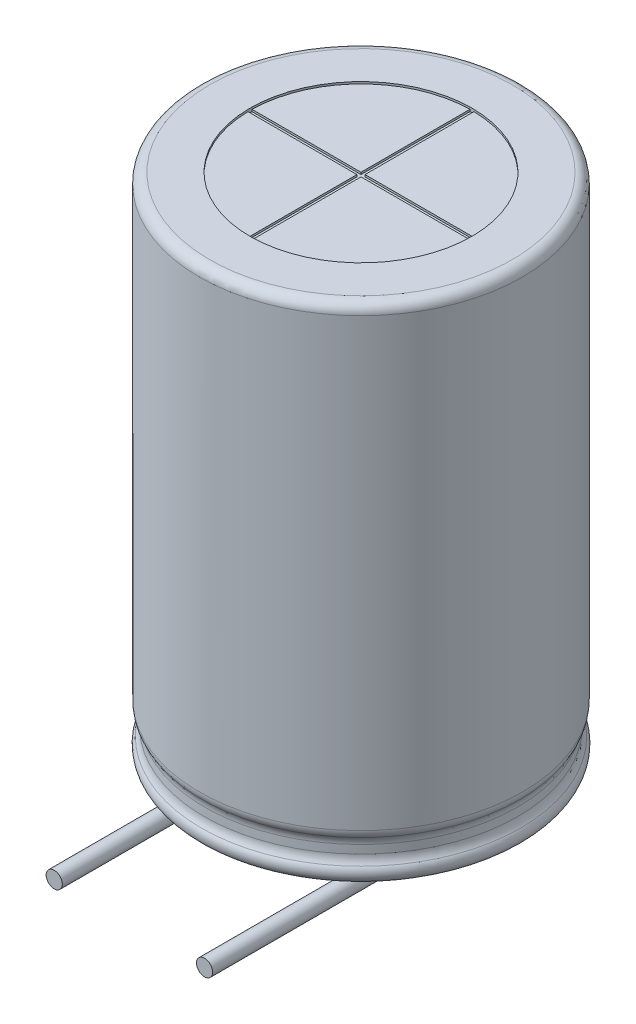
ISO-10303-21;
HEADER;
FILE_DESCRIPTION(('STEP AP214'),'2;1');
FILE_NAME('part.step','',(''),(''),'','','');
FILE_SCHEMA(('AUTOMOTIVE_DESIGN { 1 0 10303 214 1 1 1 1 }'));
ENDSEC;
DATA;
#1=APPLICATION_CONTEXT('core data for automotive mechanical design processes');
#2=APPLICATION_PROTOCOL_DEFINITION('international standard','automotive_design',2000,#1);
#3=PRODUCT_CONTEXT('',#1,'mechanical');
#4=PRODUCT('Part','Part','',(#3));
#5=PRODUCT_RELATED_PRODUCT_CATEGORY('part','',(#4));
#6=PRODUCT_DEFINITION_FORMATION('','',#4);
#7=PRODUCT_DEFINITION_CONTEXT('part definition',#1,'design');
#8=PRODUCT_DEFINITION('design','',#6,#7);
#9=PRODUCT_DEFINITION_SHAPE('','',#8);
#10=(LENGTH_UNIT() NAMED_UNIT(*) SI_UNIT(.MILLI.,.METRE.));
#11=(NAMED_UNIT(*) PLANE_ANGLE_UNIT() SI_UNIT($,.RADIAN.));
#12=(NAMED_UNIT(*) SI_UNIT($,.STERADIAN.) SOLID_ANGLE_UNIT());
#13=UNCERTAINTY_MEASURE_WITH_UNIT(LENGTH_MEASURE(1.E-05),#10,'distance_accuracy_value','');
#14=(GEOMETRIC_REPRESENTATION_CONTEXT(3) GLOBAL_UNCERTAINTY_ASSIGNED_CONTEXT((#13)) GLOBAL_UNIT_ASSIGNED_CONTEXT((#10,
#11,#12)) REPRESENTATION_CONTEXT('',''));
#15=CARTESIAN_POINT('',(0.,0.,0.));
#16=DIRECTION('',(0.,0.,1.));
#17=DIRECTION('',(1.,0.,0.));
#18=AXIS2_PLACEMENT_3D('',#15,#16,#17);
#19=CARTESIAN_POINT('',(0.,24.9,0.));
#20=DIRECTION('',(0.,-1.,0.));
#21=DIRECTION('',(0.,0.,-1.));
#22=AXIS2_PLACEMENT_3D('',#19,#20,#21);
#23=PLANE('',#22);
#24=CARTESIAN_POINT('',(0.,24.9,0.));
#25=DIRECTION('',(0.,1.,0.));
#26=DIRECTION('',(0.,0.,-1.));
#27=AXIS2_PLACEMENT_3D('',#24,#25,#26);
#28=CIRCLE('',#27,5.5);
#29=CARTESIAN_POINT('',(0.0999999999999808,24.9,5.499090833947));
#30=VERTEX_POINT('',#29);
#31=CARTESIAN_POINT('',(5.49909083394701,24.9,0.100000000000018));
#32=VERTEX_POINT('',#31);
#33=EDGE_CURVE('E145',#30,#32,#28,.T.);
#34=ORIENTED_EDGE('',*,*,#33,.T.);
#35=DIRECTION('',(1.,0.,0.));
#36=VECTOR('',#35,1.);
#37=CARTESIAN_POINT('',(0.100000000000001,24.9,0.0999999999999997));
#38=LINE('',#37,#36);
#39=CARTESIAN_POINT('',(0.100000000000001,24.9,0.0999999999999997));
#40=VERTEX_POINT('',#39);
#41=EDGE_CURVE('E179',#40,#32,#38,.T.);
#42=ORIENTED_EDGE('',*,*,#41,.F.);
#43=DIRECTION('',(0.,0.,-1.));
#44=VECTOR('',#43,1.);
#45=CARTESIAN_POINT('',(0.0999999999999823,24.9,5.499090833947));
#46=LINE('',#45,#44);
#47=EDGE_CURVE('E177',#30,#40,#46,.T.);
#48=ORIENTED_EDGE('',*,*,#47,.F.);
#49=EDGE_LOOP('',(#34,#42,#48));
#50=FACE_BOUND('',#49,.T.);
#51=ADVANCED_FACE('F35',(#50),#23,.F.);
#52=CARTESIAN_POINT('',(-5.499090833947,24.9,0.0999999999999632));
#53=VERTEX_POINT('',#52);
#54=CARTESIAN_POINT('',(-0.100000000000037,24.9,5.49909083394701));
#55=VERTEX_POINT('',#54);
#56=EDGE_CURVE('E204',#53,#55,#28,.T.);
#57=ORIENTED_EDGE('',*,*,#56,.T.);
#58=DIRECTION('',(0.,0.,1.));
#59=VECTOR('',#58,1.);
#60=CARTESIAN_POINT('',(-0.1,24.9,0.100000000000001));
#61=LINE('',#60,#59);
#62=CARTESIAN_POINT('',(-0.1,24.9,0.100000000000001));
#63=VERTEX_POINT('',#62);
#64=EDGE_CURVE('E174',#63,#55,#61,.T.);
#65=ORIENTED_EDGE('',*,*,#64,.F.);
#66=DIRECTION('',(1.,0.,0.));
#67=VECTOR('',#66,1.);
#68=CARTESIAN_POINT('',(-5.49909083394701,24.9,0.0999999999999631));
#69=LINE('',#68,#67);
#70=EDGE_CURVE('E171',#53,#63,#69,.T.);
#71=ORIENTED_EDGE('',*,*,#70,.F.);
#72=EDGE_LOOP('',(#57,#65,#71));
#73=FACE_BOUND('',#72,.T.);
#74=ADVANCED_FACE('F306',(#73),#23,.F.);
#75=CARTESIAN_POINT('',(-0.0999999999999423,24.9,-5.49909083394701));
#76=VERTEX_POINT('',#75);
#77=CARTESIAN_POINT('',(-5.49909083394701,24.9,-0.100000000000056));
#78=VERTEX_POINT('',#77);
#79=EDGE_CURVE('E200',#76,#78,#28,.T.);
#80=ORIENTED_EDGE('',*,*,#79,.T.);
#81=DIRECTION('',(-1.,0.,0.));
#82=VECTOR('',#81,1.);
#83=CARTESIAN_POINT('',(-0.1,24.9,-0.1));
#84=LINE('',#83,#82);
#85=CARTESIAN_POINT('',(-0.1,24.9,-0.1));
#86=VERTEX_POINT('',#85);
#87=EDGE_CURVE('E168',#86,#78,#84,.T.);
#88=ORIENTED_EDGE('',*,*,#87,.F.);
#89=DIRECTION('',(0.,0.,1.));
#90=VECTOR('',#89,1.);
#91=CARTESIAN_POINT('',(-0.0999999999999439,24.9,-5.49909083394701));
#92=LINE('',#91,#90);
#93=EDGE_CURVE('E165',#76,#86,#92,.T.);
#94=ORIENTED_EDGE('',*,*,#93,.F.);
#95=EDGE_LOOP('',(#80,#88,#94));
#96=FACE_BOUND('',#95,.T.);
#97=ADVANCED_FACE('F310',(#96),#23,.F.);
#98=CARTESIAN_POINT('',(0.,25.,0.));
#99=DIRECTION('',(0.,-1.,0.));
#100=DIRECTION('',(1.,0.,0.));
#101=AXIS2_PLACEMENT_3D('',#98,#99,#100);
#102=CYLINDRICAL_SURFACE('',#101,8.);
#103=CARTESIAN_POINT('',(0.,24.5,0.));
#104=DIRECTION('',(0.,1.,0.));
#105=DIRECTION('',(-1.,0.,0.));
#106=AXIS2_PLACEMENT_3D('',#103,#104,#105);
#107=CIRCLE('',#106,8.);
#108=CARTESIAN_POINT('',(-8.,24.5,0.));
#109=VERTEX_POINT('',#108);
#110=EDGE_CURVE('E219',#109,#109,#107,.F.);
#111=ORIENTED_EDGE('',*,*,#110,.T.);
#112=EDGE_LOOP('',(#111));
#113=FACE_BOUND('',#112,.T.);
#114=CARTESIAN_POINT('',(0.,2.40756880196224,0.));
#115=DIRECTION('',(0.,-1.,0.));
#116=DIRECTION('',(1.,0.,0.));
#117=AXIS2_PLACEMENT_3D('',#114,#115,#116);
#118=CIRCLE('',#117,8.);
#119=CARTESIAN_POINT('',(8.,2.40756880196224,0.));
#120=VERTEX_POINT('',#119);
#121=EDGE_CURVE('E203',#120,#120,#118,.T.);
#122=ORIENTED_EDGE('',*,*,#121,.F.);
#123=EDGE_LOOP('',(#122));
#124=FACE_BOUND('',#123,.T.);
#125=ADVANCED_FACE('F322',(#113,#124),#102,.T.);
#126=CARTESIAN_POINT('',(8.,25.,0.));
#127=DIRECTION('',(0.,1.,0.));
#128=DIRECTION('',(-1.,0.,0.));
#129=AXIS2_PLACEMENT_3D('',#126,#127,#128);
#130=PLANE('',#129);
#131=CARTESIAN_POINT('',(0.,25.,0.));
#132=DIRECTION('',(0.,1.,0.));
#133=DIRECTION('',(-1.,0.,0.));
#134=AXIS2_PLACEMENT_3D('',#131,#132,#133);
#135=CIRCLE('',#134,7.5);
#136=CARTESIAN_POINT('',(-7.5,25.,0.));
#137=VERTEX_POINT('',#136);
#138=EDGE_CURVE('E222',#137,#137,#135,.T.);
#139=ORIENTED_EDGE('',*,*,#138,.T.);
#140=EDGE_LOOP('',(#139));
#141=FACE_BOUND('',#140,.T.);
#142=CARTESIAN_POINT('',(0.,25.,0.));
#143=DIRECTION('',(0.,1.,0.));
#144=DIRECTION('',(0.,0.,-1.));
#145=AXIS2_PLACEMENT_3D('',#142,#143,#144);
#146=CIRCLE('',#145,5.5);
#147=CARTESIAN_POINT('',(0.,25.,-5.5));
#148=VERTEX_POINT('',#147);
#149=EDGE_CURVE('E182',#148,#148,#146,.T.);
#150=ORIENTED_EDGE('',*,*,#149,.F.);
#151=EDGE_LOOP('',(#150));
#152=FACE_BOUND('',#151,.T.);
#153=ADVANCED_FACE('F327',(#141,#152),#130,.T.);
#154=CARTESIAN_POINT('',(0.,0.,0.));
#155=DIRECTION('',(0.,-1.,0.));
#156=DIRECTION('',(1.,0.,0.));
#157=AXIS2_PLACEMENT_3D('',#154,#155,#156);
#158=PLANE('',#157);
#159=CARTESIAN_POINT('',(0.,0.,0.));
#160=DIRECTION('',(0.,-1.,0.));
#161=DIRECTION('',(1.,0.,0.));
#162=AXIS2_PLACEMENT_3D('',#159,#160,#161);
#163=CIRCLE('',#162,7.51793220524762);
#164=CARTESIAN_POINT('',(7.51793220524762,0.,0.));
#165=VERTEX_POINT('',#164);
#166=EDGE_CURVE('E225',#165,#165,#163,.T.);
#167=ORIENTED_EDGE('',*,*,#166,.T.);
#168=EDGE_LOOP('',(#167));
#169=FACE_BOUND('',#168,.T.);
#170=CARTESIAN_POINT('',(0.,0.,0.));
#171=DIRECTION('',(0.,-1.,0.));
#172=DIRECTION('',(1.,0.,0.));
#173=AXIS2_PLACEMENT_3D('',#170,#171,#172);
#174=CIRCLE('',#173,5.5);
#175=CARTESIAN_POINT('',(5.5,0.,0.));
#176=VERTEX_POINT('',#175);
#177=EDGE_CURVE('E245',#176,#176,#174,.T.);
#178=ORIENTED_EDGE('',*,*,#177,.F.);
#179=EDGE_LOOP('',(#178));
#180=FACE_BOUND('',#179,.T.);
#181=ADVANCED_FACE('F603',(#169,#180),#158,.T.);
#182=CARTESIAN_POINT('',(0.,1.23259900370742,0.));
#183=DIRECTION('',(0.,-1.,0.));
#184=DIRECTION('',(1.,0.,0.));
#185=AXIS2_PLACEMENT_3D('',#182,#183,#184);
#186=TOROIDAL_SURFACE('',#185,8.43125,0.670833333333331);
#187=CARTESIAN_POINT('',(0.,0.812853667063678,0.));
#188=DIRECTION('',(0.,1.,0.));
#189=DIRECTION('',(-1.,0.,0.));
#190=AXIS2_PLACEMENT_3D('',#187,#188,#189);
#191=CIRCLE('',#190,7.90796115674331);
#192=CARTESIAN_POINT('',(-7.90796115674331,0.812853667063677,0.));
#193=VERTEX_POINT('',#192);
#194=EDGE_CURVE('E228',#193,#193,#191,.T.);
#195=ORIENTED_EDGE('',*,*,#194,.T.);
#196=EDGE_LOOP('',(#195));
#197=FACE_BOUND('',#196,.T.);
#198=CARTESIAN_POINT('',(0.,1.23259900370742,0.));
#199=DIRECTION('',(0.,-1.,0.));
#200=DIRECTION('',(1.,0.,0.));
#201=AXIS2_PLACEMENT_3D('',#198,#199,#200);
#202=CIRCLE('',#201,7.76041666666666);
#203=CARTESIAN_POINT('',(7.76041666666666,1.23259900370742,0.));
#204=VERTEX_POINT('',#203);
#205=EDGE_CURVE('E216',#204,#204,#202,.T.);
#206=ORIENTED_EDGE('',*,*,#205,.T.);
#207=EDGE_LOOP('',(#206));
#208=FACE_BOUND('',#207,.T.);
#209=ADVANCED_FACE('F593',(#197,#208),#186,.F.);
#210=CARTESIAN_POINT('',(0.,25.,0.));
#211=DIRECTION('',(0.,-1.,0.));
#212=DIRECTION('',(1.,0.,0.));
#213=AXIS2_PLACEMENT_3D('',#210,#211,#212);
#214=CYLINDRICAL_SURFACE('',#213,7.76041666666666);
#215=CARTESIAN_POINT('',(0.,1.64240099629257,0.));
#216=DIRECTION('',(0.,-1.,0.));
#217=DIRECTION('',(1.,0.,0.));
#218=AXIS2_PLACEMENT_3D('',#215,#216,#217);
#219=CIRCLE('',#218,7.76041666666667);
#220=CARTESIAN_POINT('',(7.76041666666667,1.64240099629258,0.));
#221=VERTEX_POINT('',#220);
#222=EDGE_CURVE('E213',#221,#221,#219,.T.);
#223=ORIENTED_EDGE('',*,*,#222,.T.);
#224=EDGE_LOOP('',(#223));
#225=FACE_BOUND('',#224,.T.);
#226=ORIENTED_EDGE('',*,*,#205,.F.);
#227=EDGE_LOOP('',(#226));
#228=FACE_BOUND('',#227,.T.);
#229=ADVANCED_FACE('F584',(#225,#228),#214,.T.);
#230=CARTESIAN_POINT('',(0.,1.64240099629258,0.));
#231=DIRECTION('',(0.,-1.,0.));
#232=DIRECTION('',(1.,0.,0.));
#233=AXIS2_PLACEMENT_3D('',#230,#231,#232);
#234=TOROIDAL_SURFACE('',#233,8.43125,0.670833333333334);
#235=CARTESIAN_POINT('',(0.,2.02498489912741,0.));
#236=DIRECTION('',(0.,-1.,0.));
#237=DIRECTION('',(1.,0.,0.));
#238=AXIS2_PLACEMENT_3D('',#235,#236,#237);
#239=CIRCLE('',#238,7.88020833333333);
#240=CARTESIAN_POINT('',(7.88020833333333,2.02498489912741,0.));
#241=VERTEX_POINT('',#240);
#242=EDGE_CURVE('E210',#241,#241,#239,.T.);
#243=ORIENTED_EDGE('',*,*,#242,.T.);
#244=EDGE_LOOP('',(#243));
#245=FACE_BOUND('',#244,.T.);
#246=ORIENTED_EDGE('',*,*,#222,.F.);
#247=EDGE_LOOP('',(#246));
#248=FACE_BOUND('',#247,.T.);
#249=ADVANCED_FACE('F574',(#245,#248),#234,.F.);
#250=CARTESIAN_POINT('',(0.,2.40756880196224,0.));
#251=DIRECTION('',(0.,-1.,0.));
#252=DIRECTION('',(1.,0.,0.));
#253=AXIS2_PLACEMENT_3D('',#250,#251,#252);
#254=TOROIDAL_SURFACE('',#253,7.32916666666666,0.670833333333332);
#255=ORIENTED_EDGE('',*,*,#121,.T.);
#256=EDGE_LOOP('',(#255));
#257=FACE_BOUND('',#256,.T.);
#258=ORIENTED_EDGE('',*,*,#242,.F.);
#259=EDGE_LOOP('',(#258));
#260=FACE_BOUND('',#259,.T.);
#261=ADVANCED_FACE('F320',(#257,#260),#254,.T.);
#262=CARTESIAN_POINT('',(0.,24.9,0.));
#263=DIRECTION('',(0.,1.,0.));
#264=DIRECTION('',(0.,0.,1.));
#265=AXIS2_PLACEMENT_3D('',#262,#263,#264);
#266=CYLINDRICAL_SURFACE('',#265,5.5);
#267=ORIENTED_EDGE('',*,*,#79,.F.);
#268=DIRECTION('',(0.,1.,0.));
#269=VECTOR('',#268,1.);
#270=CARTESIAN_POINT('',(-0.0999999999999423,24.8,-5.49909083394701));
#271=LINE('',#270,#269);
#272=CARTESIAN_POINT('',(-0.0999999999999423,24.8,-5.49909083394701));
#273=VERTEX_POINT('',#272);
#274=EDGE_CURVE('E193',#273,#76,#271,.T.);
#275=ORIENTED_EDGE('',*,*,#274,.F.);
#276=CARTESIAN_POINT('',(0.,24.8,0.));
#277=DIRECTION('',(0.,1.,0.));
#278=DIRECTION('',(0.,0.,1.));
#279=AXIS2_PLACEMENT_3D('',#276,#277,#278);
#280=CIRCLE('',#279,5.5);
#281=CARTESIAN_POINT('',(0.0999999999999986,24.8,-5.49909083394701));
#282=VERTEX_POINT('',#281);
#283=EDGE_CURVE('E260',#282,#273,#280,.T.);
#284=ORIENTED_EDGE('',*,*,#283,.F.);
#285=DIRECTION('',(0.,1.,0.));
#286=VECTOR('',#285,1.);
#287=CARTESIAN_POINT('',(0.0999999999999986,24.8,-5.49909083394701));
#288=LINE('',#287,#286);
#289=CARTESIAN_POINT('',(0.0999999999999986,24.9,-5.49909083394701));
#290=VERTEX_POINT('',#289);
#291=EDGE_CURVE('E195',#282,#290,#288,.T.);
#292=ORIENTED_EDGE('',*,*,#291,.T.);
#293=CARTESIAN_POINT('',(5.499090833947,24.9,-0.100000000000002));
#294=VERTEX_POINT('',#293);
#295=EDGE_CURVE('E205',#294,#290,#28,.T.);
#296=ORIENTED_EDGE('',*,*,#295,.F.);
#297=DIRECTION('',(0.,1.,0.));
#298=VECTOR('',#297,1.);
#299=CARTESIAN_POINT('',(5.499090833947,24.8,-0.100000000000002));
#300=LINE('',#299,#298);
#301=CARTESIAN_POINT('',(5.499090833947,24.8,-0.100000000000002));
#302=VERTEX_POINT('',#301);
#303=EDGE_CURVE('E50',#302,#294,#300,.T.);
#304=ORIENTED_EDGE('',*,*,#303,.F.);
#305=CARTESIAN_POINT('',(0.,24.8,0.));
#306=DIRECTION('',(0.,1.,0.));
#307=DIRECTION('',(0.,0.,1.));
#308=AXIS2_PLACEMENT_3D('',#305,#306,#307);
#309=CIRCLE('',#308,5.5);
#310=CARTESIAN_POINT('',(5.49909083394701,24.8,0.100000000000018));
#311=VERTEX_POINT('',#310);
#312=EDGE_CURVE('E58',#311,#302,#309,.T.);
#313=ORIENTED_EDGE('',*,*,#312,.F.);
#314=DIRECTION('',(0.,1.,0.));
#315=VECTOR('',#314,1.);
#316=CARTESIAN_POINT('',(5.49909083394701,24.8,0.100000000000018));
#317=LINE('',#316,#315);
#318=EDGE_CURVE('E97',#311,#32,#317,.T.);
#319=ORIENTED_EDGE('',*,*,#318,.T.);
#320=ORIENTED_EDGE('',*,*,#33,.F.);
#321=DIRECTION('',(0.,1.,0.));
#322=VECTOR('',#321,1.);
#323=CARTESIAN_POINT('',(0.0999999999999808,24.8,5.499090833947));
#324=LINE('',#323,#322);
#325=CARTESIAN_POINT('',(0.0999999999999808,24.8,5.499090833947));
#326=VERTEX_POINT('',#325);
#327=EDGE_CURVE('E140',#326,#30,#324,.T.);
#328=ORIENTED_EDGE('',*,*,#327,.F.);
#329=CARTESIAN_POINT('',(0.,24.8,0.));
#330=DIRECTION('',(0.,1.,0.));
#331=DIRECTION('',(0.,0.,1.));
#332=AXIS2_PLACEMENT_3D('',#329,#330,#331);
#333=CIRCLE('',#332,5.5);
#334=CARTESIAN_POINT('',(-0.100000000000037,24.8,5.49909083394701));
#335=VERTEX_POINT('',#334);
#336=EDGE_CURVE('E130',#335,#326,#333,.T.);
#337=ORIENTED_EDGE('',*,*,#336,.F.);
#338=DIRECTION('',(0.,1.,0.));
#339=VECTOR('',#338,1.);
#340=CARTESIAN_POINT('',(-0.100000000000037,24.8,5.49909083394701));
#341=LINE('',#340,#339);
#342=EDGE_CURVE('E150',#335,#55,#341,.T.);
#343=ORIENTED_EDGE('',*,*,#342,.T.);
#344=ORIENTED_EDGE('',*,*,#56,.F.);
#345=DIRECTION('',(0.,1.,0.));
#346=VECTOR('',#345,1.);
#347=CARTESIAN_POINT('',(-5.499090833947,24.8,0.0999999999999632));
#348=LINE('',#347,#346);
#349=CARTESIAN_POINT('',(-5.499090833947,24.8,0.0999999999999632));
#350=VERTEX_POINT('',#349);
#351=EDGE_CURVE('E187',#350,#53,#348,.T.);
#352=ORIENTED_EDGE('',*,*,#351,.F.);
#353=CARTESIAN_POINT('',(0.,24.8,0.));
#354=DIRECTION('',(0.,1.,0.));
#355=DIRECTION('',(0.,0.,1.));
#356=AXIS2_PLACEMENT_3D('',#353,#354,#355);
#357=CIRCLE('',#356,5.49999999999999);
#358=CARTESIAN_POINT('',(-5.49909083394701,24.8,-0.100000000000056));
#359=VERTEX_POINT('',#358);
#360=EDGE_CURVE('E268',#359,#350,#357,.T.);
#361=ORIENTED_EDGE('',*,*,#360,.F.);
#362=DIRECTION('',(0.,1.,0.));
#363=VECTOR('',#362,1.);
#364=CARTESIAN_POINT('',(-5.49909083394701,24.8,-0.100000000000056));
#365=LINE('',#364,#363);
#366=EDGE_CURVE('E189',#359,#78,#365,.T.);
#367=ORIENTED_EDGE('',*,*,#366,.T.);
#368=EDGE_LOOP('',(#267,#275,#284,#292,#296,#304,#313,#319,#320,#328,#337,#343,#344,#352,#361,#367));
#369=FACE_BOUND('',#368,.T.);
#370=ORIENTED_EDGE('',*,*,#149,.T.);
#371=EDGE_LOOP('',(#370));
#372=FACE_BOUND('',#371,.T.);
#373=ADVANCED_FACE('F142',(#369,#372),#266,.F.);
#374=ORIENTED_EDGE('',*,*,#295,.T.);
#375=DIRECTION('',(0.,0.,-1.));
#376=VECTOR('',#375,1.);
#377=CARTESIAN_POINT('',(0.0999999999999994,24.9,-0.100000000000002));
#378=LINE('',#377,#376);
#379=CARTESIAN_POINT('',(0.0999999999999994,24.9,-0.100000000000002));
#380=VERTEX_POINT('',#379);
#381=EDGE_CURVE('E161',#380,#290,#378,.T.);
#382=ORIENTED_EDGE('',*,*,#381,.F.);
#383=DIRECTION('',(-1.,0.,0.));
#384=VECTOR('',#383,1.);
#385=CARTESIAN_POINT('',(5.499090833947,24.9,-0.100000000000002));
#386=LINE('',#385,#384);
#387=EDGE_CURVE('E159',#294,#380,#386,.T.);
#388=ORIENTED_EDGE('',*,*,#387,.F.);
#389=EDGE_LOOP('',(#374,#382,#388));
#390=FACE_BOUND('',#389,.T.);
#391=ADVANCED_FACE('F288',(#390),#23,.F.);
#392=CARTESIAN_POINT('',(0.100000000000001,24.8,0.0999999999999997));
#393=DIRECTION('',(0.,0.,1.));
#394=DIRECTION('',(1.,0.,0.));
#395=AXIS2_PLACEMENT_3D('',#392,#393,#394);
#396=PLANE('',#395);
#397=ORIENTED_EDGE('',*,*,#41,.T.);
#398=ORIENTED_EDGE('',*,*,#318,.F.);
#399=DIRECTION('',(1.,0.,0.));
#400=VECTOR('',#399,1.);
#401=CARTESIAN_POINT('',(0.100000000000001,24.8,0.0999999999999997));
#402=LINE('',#401,#400);
#403=CARTESIAN_POINT('',(0.100000000000001,24.8,0.0999999999999997));
#404=VERTEX_POINT('',#403);
#405=EDGE_CURVE('E154',#404,#311,#402,.T.);
#406=ORIENTED_EDGE('',*,*,#405,.F.);
#407=DIRECTION('',(0.,1.,0.));
#408=VECTOR('',#407,1.);
#409=CARTESIAN_POINT('',(0.100000000000001,24.8,0.0999999999999997));
#410=LINE('',#409,#408);
#411=EDGE_CURVE('E149',#404,#40,#410,.T.);
#412=ORIENTED_EDGE('',*,*,#411,.T.);
#413=EDGE_LOOP('',(#397,#398,#406,#412));
#414=FACE_BOUND('',#413,.T.);
#415=ADVANCED_FACE('F313',(#414),#396,.F.);
#416=CARTESIAN_POINT('',(0.0999999999999823,24.8,5.499090833947));
#417=DIRECTION('',(1.,0.,0.));
#418=DIRECTION('',(0.,0.,-1.));
#419=AXIS2_PLACEMENT_3D('',#416,#417,#418);
#420=PLANE('',#419);
#421=ORIENTED_EDGE('',*,*,#47,.T.);
#422=ORIENTED_EDGE('',*,*,#411,.F.);
#423=DIRECTION('',(0.,0.,-1.));
#424=VECTOR('',#423,1.);
#425=CARTESIAN_POINT('',(0.0999999999999823,24.8,5.499090833947));
#426=LINE('',#425,#424);
#427=EDGE_CURVE('E135',#326,#404,#426,.T.);
#428=ORIENTED_EDGE('',*,*,#427,.F.);
#429=ORIENTED_EDGE('',*,*,#327,.T.);
#430=EDGE_LOOP('',(#421,#422,#428,#429));
#431=FACE_BOUND('',#430,.T.);
#432=ADVANCED_FACE('F152',(#431),#420,.F.);
#433=CARTESIAN_POINT('',(-0.1,24.8,0.100000000000001));
#434=DIRECTION('',(-1.,0.,0.));
#435=DIRECTION('',(0.,0.,1.));
#436=AXIS2_PLACEMENT_3D('',#433,#434,#435);
#437=PLANE('',#436);
#438=ORIENTED_EDGE('',*,*,#64,.T.);
#439=ORIENTED_EDGE('',*,*,#342,.F.);
#440=DIRECTION('',(0.,0.,1.));
#441=VECTOR('',#440,1.);
#442=CARTESIAN_POINT('',(-0.1,24.8,0.100000000000001));
#443=LINE('',#442,#441);
#444=CARTESIAN_POINT('',(-0.1,24.8,0.100000000000001));
#445=VERTEX_POINT('',#444);
#446=EDGE_CURVE('E138',#445,#335,#443,.T.);
#447=ORIENTED_EDGE('',*,*,#446,.F.);
#448=DIRECTION('',(0.,1.,0.));
#449=VECTOR('',#448,1.);
#450=CARTESIAN_POINT('',(-0.1,24.8,0.100000000000001));
#451=LINE('',#450,#449);
#452=EDGE_CURVE('E185',#445,#63,#451,.T.);
#453=ORIENTED_EDGE('',*,*,#452,.T.);
#454=EDGE_LOOP('',(#438,#439,#447,#453));
#455=FACE_BOUND('',#454,.T.);
#456=ADVANCED_FACE('F279',(#455),#437,.F.);
#457=CARTESIAN_POINT('',(-5.49909083394701,24.8,0.0999999999999631));
#458=DIRECTION('',(0.,0.,1.));
#459=DIRECTION('',(1.,0.,0.));
#460=AXIS2_PLACEMENT_3D('',#457,#458,#459);
#461=PLANE('',#460);
#462=ORIENTED_EDGE('',*,*,#70,.T.);
#463=ORIENTED_EDGE('',*,*,#452,.F.);
#464=DIRECTION('',(1.,0.,0.));
#465=VECTOR('',#464,1.);
#466=CARTESIAN_POINT('',(-5.49909083394701,24.8,0.0999999999999631));
#467=LINE('',#466,#465);
#468=EDGE_CURVE('E270',#350,#445,#467,.T.);
#469=ORIENTED_EDGE('',*,*,#468,.F.);
#470=ORIENTED_EDGE('',*,*,#351,.T.);
#471=EDGE_LOOP('',(#462,#463,#469,#470));
#472=FACE_BOUND('',#471,.T.);
#473=ADVANCED_FACE('F275',(#472),#461,.F.);
#474=CARTESIAN_POINT('',(-0.1,24.8,-0.1));
#475=DIRECTION('',(0.,0.,-1.));
#476=DIRECTION('',(-1.,0.,0.));
#477=AXIS2_PLACEMENT_3D('',#474,#475,#476);
#478=PLANE('',#477);
#479=ORIENTED_EDGE('',*,*,#87,.T.);
#480=ORIENTED_EDGE('',*,*,#366,.F.);
#481=DIRECTION('',(-1.,0.,0.));
#482=VECTOR('',#481,1.);
#483=CARTESIAN_POINT('',(-0.1,24.8,-0.1));
#484=LINE('',#483,#482);
#485=CARTESIAN_POINT('',(-0.1,24.8,-0.1));
#486=VERTEX_POINT('',#485);
#487=EDGE_CURVE('E265',#486,#359,#484,.T.);
#488=ORIENTED_EDGE('',*,*,#487,.F.);
#489=DIRECTION('',(0.,1.,0.));
#490=VECTOR('',#489,1.);
#491=CARTESIAN_POINT('',(-0.1,24.8,-0.1));
#492=LINE('',#491,#490);
#493=EDGE_CURVE('E191',#486,#86,#492,.T.);
#494=ORIENTED_EDGE('',*,*,#493,.T.);
#495=EDGE_LOOP('',(#479,#480,#488,#494));
#496=FACE_BOUND('',#495,.T.);
#497=ADVANCED_FACE('F335',(#496),#478,.F.);
#498=CARTESIAN_POINT('',(-0.0999999999999439,24.8,-5.49909083394701));
#499=DIRECTION('',(-1.,0.,0.));
#500=DIRECTION('',(0.,0.,1.));
#501=AXIS2_PLACEMENT_3D('',#498,#499,#500);
#502=PLANE('',#501);
#503=ORIENTED_EDGE('',*,*,#93,.T.);
#504=ORIENTED_EDGE('',*,*,#493,.F.);
#505=DIRECTION('',(0.,0.,1.));
#506=VECTOR('',#505,1.);
#507=CARTESIAN_POINT('',(-0.0999999999999439,24.8,-5.49909083394701));
#508=LINE('',#507,#506);
#509=EDGE_CURVE('E262',#273,#486,#508,.T.);
#510=ORIENTED_EDGE('',*,*,#509,.F.);
#511=ORIENTED_EDGE('',*,*,#274,.T.);
#512=EDGE_LOOP('',(#503,#504,#510,#511));
#513=FACE_BOUND('',#512,.T.);
#514=ADVANCED_FACE('F302',(#513),#502,.F.);
#515=CARTESIAN_POINT('',(0.0999999999999994,24.8,-0.100000000000002));
#516=DIRECTION('',(1.,0.,0.));
#517=DIRECTION('',(0.,0.,-1.));
#518=AXIS2_PLACEMENT_3D('',#515,#516,#517);
#519=PLANE('',#518);
#520=ORIENTED_EDGE('',*,*,#381,.T.);
#521=ORIENTED_EDGE('',*,*,#291,.F.);
#522=DIRECTION('',(0.,0.,-1.));
#523=VECTOR('',#522,1.);
#524=CARTESIAN_POINT('',(0.0999999999999994,24.8,-0.100000000000002));
#525=LINE('',#524,#523);
#526=CARTESIAN_POINT('',(0.0999999999999994,24.8,-0.100000000000002));
#527=VERTEX_POINT('',#526);
#528=EDGE_CURVE('E257',#527,#282,#525,.T.);
#529=ORIENTED_EDGE('',*,*,#528,.F.);
#530=DIRECTION('',(0.,1.,0.));
#531=VECTOR('',#530,1.);
#532=CARTESIAN_POINT('',(0.0999999999999994,24.8,-0.100000000000002));
#533=LINE('',#532,#531);
#534=EDGE_CURVE('E197',#527,#380,#533,.T.);
#535=ORIENTED_EDGE('',*,*,#534,.T.);
#536=EDGE_LOOP('',(#520,#521,#529,#535));
#537=FACE_BOUND('',#536,.T.);
#538=ADVANCED_FACE('F293',(#537),#519,.F.);
#539=CARTESIAN_POINT('',(5.499090833947,24.8,-0.100000000000002));
#540=DIRECTION('',(0.,0.,-1.));
#541=DIRECTION('',(-1.,0.,0.));
#542=AXIS2_PLACEMENT_3D('',#539,#540,#541);
#543=PLANE('',#542);
#544=ORIENTED_EDGE('',*,*,#387,.T.);
#545=ORIENTED_EDGE('',*,*,#534,.F.);
#546=DIRECTION('',(-1.,0.,0.));
#547=VECTOR('',#546,1.);
#548=CARTESIAN_POINT('',(5.499090833947,24.8,-0.100000000000002));
#549=LINE('',#548,#547);
#550=EDGE_CURVE('E254',#302,#527,#549,.T.);
#551=ORIENTED_EDGE('',*,*,#550,.F.);
#552=ORIENTED_EDGE('',*,*,#303,.T.);
#553=EDGE_LOOP('',(#544,#545,#551,#552));
#554=FACE_BOUND('',#553,.T.);
#555=ADVANCED_FACE('F294',(#554),#543,.F.);
#556=CARTESIAN_POINT('',(0.,24.8,0.));
#557=DIRECTION('',(0.,1.,0.));
#558=DIRECTION('',(0.,0.,1.));
#559=AXIS2_PLACEMENT_3D('',#556,#557,#558);
#560=PLANE('',#559);
#561=ORIENTED_EDGE('',*,*,#312,.T.);
#562=ORIENTED_EDGE('',*,*,#550,.T.);
#563=ORIENTED_EDGE('',*,*,#528,.T.);
#564=ORIENTED_EDGE('',*,*,#283,.T.);
#565=ORIENTED_EDGE('',*,*,#509,.T.);
#566=ORIENTED_EDGE('',*,*,#487,.T.);
#567=ORIENTED_EDGE('',*,*,#360,.T.);
#568=ORIENTED_EDGE('',*,*,#468,.T.);
#569=ORIENTED_EDGE('',*,*,#446,.T.);
#570=ORIENTED_EDGE('',*,*,#336,.T.);
#571=ORIENTED_EDGE('',*,*,#427,.T.);
#572=ORIENTED_EDGE('',*,*,#405,.T.);
#573=EDGE_LOOP('',(#561,#562,#563,#564,#565,#566,#567,#568,#569,#570,#571,#572));
#574=FACE_BOUND('',#573,.T.);
#575=ADVANCED_FACE('F132',(#574),#560,.T.);
#576=CARTESIAN_POINT('',(0.,0.25,0.));
#577=DIRECTION('',(0.,-1.,0.));
#578=DIRECTION('',(1.,0.,0.));
#579=AXIS2_PLACEMENT_3D('',#576,#577,#578);
#580=CYLINDRICAL_SURFACE('',#579,5.5);
#581=CARTESIAN_POINT('',(0.,0.25,0.));
#582=DIRECTION('',(0.,-1.,0.));
#583=DIRECTION('',(1.,0.,0.));
#584=AXIS2_PLACEMENT_3D('',#581,#582,#583);
#585=CIRCLE('',#584,5.5);
#586=CARTESIAN_POINT('',(5.5,0.250000000000001,0.));
#587=VERTEX_POINT('',#586);
#588=EDGE_CURVE('E162',#587,#587,#585,.T.);
#589=ORIENTED_EDGE('',*,*,#588,.F.);
#590=EDGE_LOOP('',(#589));
#591=FACE_BOUND('',#590,.T.);
#592=ORIENTED_EDGE('',*,*,#177,.T.);
#593=EDGE_LOOP('',(#592));
#594=FACE_BOUND('',#593,.T.);
#595=ADVANCED_FACE('F239',(#591,#594),#580,.F.);
#596=CARTESIAN_POINT('',(0.,0.25,0.));
#597=DIRECTION('',(0.,-1.,0.));
#598=DIRECTION('',(1.,0.,0.));
#599=AXIS2_PLACEMENT_3D('',#596,#597,#598);
#600=PLANE('',#599);
#601=CARTESIAN_POINT('',(-3.75,0.25,-0.0522769775912479));
#602=DIRECTION('',(0.,-1.,0.));
#603=DIRECTION('',(1.,0.,0.));
#604=AXIS2_PLACEMENT_3D('',#601,#602,#603);
#605=CIRCLE('',#604,0.4);
#606=CARTESIAN_POINT('',(-3.35,0.25,-0.0522769775912479));
#607=VERTEX_POINT('',#606);
#608=EDGE_CURVE('E11',#607,#607,#605,.T.);
#609=ORIENTED_EDGE('',*,*,#608,.F.);
#610=EDGE_LOOP('',(#609));
#611=FACE_BOUND('',#610,.T.);
#612=CARTESIAN_POINT('',(3.75,0.25,0.));
#613=DIRECTION('',(0.,-1.,0.));
#614=DIRECTION('',(1.,0.,0.));
#615=AXIS2_PLACEMENT_3D('',#612,#613,#614);
#616=CIRCLE('',#615,0.4);
#617=CARTESIAN_POINT('',(4.15,0.25,0.));
#618=VERTEX_POINT('',#617);
#619=EDGE_CURVE('E43',#618,#618,#616,.T.);
#620=ORIENTED_EDGE('',*,*,#619,.F.);
#621=EDGE_LOOP('',(#620));
#622=FACE_BOUND('',#621,.T.);
#623=ORIENTED_EDGE('',*,*,#588,.T.);
#624=EDGE_LOOP('',(#623));
#625=FACE_BOUND('',#624,.T.);
#626=ADVANCED_FACE('F235',(#611,#622,#625),#600,.T.);
#627=CARTESIAN_POINT('',(0.,24.5,0.));
#628=DIRECTION('',(0.,1.,0.));
#629=DIRECTION('',(-1.,0.,0.));
#630=AXIS2_PLACEMENT_3D('',#627,#628,#629);
#631=TOROIDAL_SURFACE('',#630,7.5,0.5);
#632=ORIENTED_EDGE('',*,*,#138,.F.);
#633=EDGE_LOOP('',(#632));
#634=FACE_BOUND('',#633,.T.);
#635=ORIENTED_EDGE('',*,*,#110,.F.);
#636=EDGE_LOOP('',(#635));
#637=FACE_BOUND('',#636,.T.);
#638=ADVANCED_FACE('F238',(#634,#637),#631,.T.);
#639=CARTESIAN_POINT('',(0.,0.499999999999999,0.));
#640=DIRECTION('',(0.,1.,0.));
#641=DIRECTION('',(-1.,0.,0.));
#642=AXIS2_PLACEMENT_3D('',#639,#640,#641);
#643=TOROIDAL_SURFACE('',#642,7.51793220524762,0.5);
#644=ORIENTED_EDGE('',*,*,#194,.F.);
#645=EDGE_LOOP('',(#644));
#646=FACE_BOUND('',#645,.T.);
#647=ORIENTED_EDGE('',*,*,#166,.F.);
#648=EDGE_LOOP('',(#647));
#649=FACE_BOUND('',#648,.T.);
#650=ADVANCED_FACE('F37',(#646,#649),#643,.T.);
#651=CARTESIAN_POINT('',(3.75,-1.5,11.5));
#652=DIRECTION('',(0.,0.,1.));
#653=DIRECTION('',(1.,0.,0.));
#654=AXIS2_PLACEMENT_3D('',#651,#652,#653);
#655=PLANE('',#654);
#656=CARTESIAN_POINT('',(3.75,-1.5,11.5));
#657=DIRECTION('',(0.,0.,1.));
#658=DIRECTION('',(1.,0.,0.));
#659=AXIS2_PLACEMENT_3D('',#656,#657,#658);
#660=CIRCLE('',#659,0.4);
#661=CARTESIAN_POINT('',(4.15,-1.5,11.5));
#662=VERTEX_POINT('',#661);
#663=EDGE_CURVE('E248',#662,#662,#660,.T.);
#664=ORIENTED_EDGE('',*,*,#663,.T.);
#665=EDGE_LOOP('',(#664));
#666=FACE_BOUND('',#665,.T.);
#667=ADVANCED_FACE('F352',(#666),#655,.T.);
#668=CARTESIAN_POINT('',(3.75,0.25,0.));
#669=DIRECTION('',(0.,-1.,0.));
#670=DIRECTION('',(0.,0.,-1.));
#671=AXIS2_PLACEMENT_3D('',#668,#669,#670);
#672=CYLINDRICAL_SURFACE('',#671,0.4);
#673=CARTESIAN_POINT('',(3.75,0.,0.));
#674=DIRECTION('',(0.,-1.,0.));
#675=DIRECTION('',(1.,0.,0.));
#676=AXIS2_PLACEMENT_3D('',#673,#674,#675);
#677=CIRCLE('',#676,0.4);
#678=CARTESIAN_POINT('',(3.75,0.,-0.400000000000001));
#679=VERTEX_POINT('',#678);
#680=EDGE_CURVE('E398',#679,#679,#677,.T.);
#681=ORIENTED_EDGE('',*,*,#680,.F.);
#682=EDGE_LOOP('',(#681));
#683=FACE_BOUND('',#682,.T.);
#684=ORIENTED_EDGE('',*,*,#619,.T.);
#685=EDGE_LOOP('',(#684));
#686=FACE_BOUND('',#685,.T.);
#687=ADVANCED_FACE('F233',(#683,#686),#672,.T.);
#688=CARTESIAN_POINT('',(3.75,0.,1.5));
#689=DIRECTION('',(-1.,0.,0.));
#690=DIRECTION('',(0.,0.,1.));
#691=AXIS2_PLACEMENT_3D('',#688,#689,#690);
#692=TOROIDAL_SURFACE('',#691,1.5,0.4);
#693=CARTESIAN_POINT('',(3.75,-1.5,1.5));
#694=DIRECTION('',(0.,0.,1.));
#695=DIRECTION('',(1.,0.,0.));
#696=AXIS2_PLACEMENT_3D('',#693,#694,#695);
#697=CIRCLE('',#696,0.4);
#698=CARTESIAN_POINT('',(3.75,-1.9,1.5));
#699=VERTEX_POINT('',#698);
#700=EDGE_CURVE('E400',#699,#699,#697,.T.);
#701=CARTESIAN_POINT('',(3.75,0.,1.5));
#702=DIRECTION('',(-1.,0.,0.));
#703=DIRECTION('',(0.,0.,1.));
#704=AXIS2_PLACEMENT_3D('',#701,#702,#703);
#705=CIRCLE('',#704,1.9);
#706=EDGE_CURVE('',#679,#699,#705,.T.);
#707=ORIENTED_EDGE('',*,*,#680,.T.);
#708=ORIENTED_EDGE('',*,*,#700,.F.);
#709=ORIENTED_EDGE('',*,*,#706,.T.);
#710=ORIENTED_EDGE('',*,*,#706,.F.);
#711=EDGE_LOOP('',(#707,#709,#708,#710));
#712=FACE_BOUND('',#711,.T.);
#713=ADVANCED_FACE('F361',(#712),#692,.T.);
#714=CARTESIAN_POINT('',(3.75,-1.5,1.5));
#715=DIRECTION('',(0.,0.,1.));
#716=DIRECTION('',(0.,-1.,0.));
#717=AXIS2_PLACEMENT_3D('',#714,#715,#716);
#718=CYLINDRICAL_SURFACE('',#717,0.4);
#719=ORIENTED_EDGE('',*,*,#663,.F.);
#720=EDGE_LOOP('',(#719));
#721=FACE_BOUND('',#720,.T.);
#722=ORIENTED_EDGE('',*,*,#700,.T.);
#723=EDGE_LOOP('',(#722));
#724=FACE_BOUND('',#723,.T.);
#725=ADVANCED_FACE('F357',(#721,#724),#718,.T.);
#726=CARTESIAN_POINT('',(-3.75,-1.5,11.4477230224088));
#727=DIRECTION('',(0.,0.,1.));
#728=DIRECTION('',(1.,0.,0.));
#729=AXIS2_PLACEMENT_3D('',#726,#727,#728);
#730=PLANE('',#729);
#731=CARTESIAN_POINT('',(-3.75,-1.5,11.4477230224088));
#732=DIRECTION('',(0.,0.,1.));
#733=DIRECTION('',(1.,0.,0.));
#734=AXIS2_PLACEMENT_3D('',#731,#732,#733);
#735=CIRCLE('',#734,0.4);
#736=CARTESIAN_POINT('',(-3.35,-1.5,11.4477230224088));
#737=VERTEX_POINT('',#736);
#738=EDGE_CURVE('E393',#737,#737,#735,.T.);
#739=ORIENTED_EDGE('',*,*,#738,.T.);
#740=EDGE_LOOP('',(#739));
#741=FACE_BOUND('',#740,.T.);
#742=ADVANCED_FACE('F360',(#741),#730,.T.);
#743=CARTESIAN_POINT('',(-3.75,0.25,-0.0522769775912479));
#744=DIRECTION('',(0.,-1.,0.));
#745=DIRECTION('',(0.,0.,-1.));
#746=AXIS2_PLACEMENT_3D('',#743,#744,#745);
#747=CYLINDRICAL_SURFACE('',#746,0.4);
#748=CARTESIAN_POINT('',(-3.75,0.,-0.0522769775912479));
#749=DIRECTION('',(0.,-1.,0.));
#750=DIRECTION('',(1.,0.,0.));
#751=AXIS2_PLACEMENT_3D('',#748,#749,#750);
#752=CIRCLE('',#751,0.4);
#753=CARTESIAN_POINT('',(-3.75,0.,-0.452276977591248));
#754=VERTEX_POINT('',#753);
#755=EDGE_CURVE('E387',#754,#754,#752,.T.);
#756=ORIENTED_EDGE('',*,*,#755,.F.);
#757=EDGE_LOOP('',(#756));
#758=FACE_BOUND('',#757,.T.);
#759=ORIENTED_EDGE('',*,*,#608,.T.);
#760=EDGE_LOOP('',(#759));
#761=FACE_BOUND('',#760,.T.);
#762=ADVANCED_FACE('F371',(#758,#761),#747,.T.);
#763=CARTESIAN_POINT('',(-3.75,0.,1.44772302240875));
#764=DIRECTION('',(-1.,0.,0.));
#765=DIRECTION('',(0.,0.,1.));
#766=AXIS2_PLACEMENT_3D('',#763,#764,#765);
#767=TOROIDAL_SURFACE('',#766,1.5,0.4);
#768=CARTESIAN_POINT('',(-3.75,-1.5,1.44772302240875));
#769=DIRECTION('',(0.,0.,1.));
#770=DIRECTION('',(1.,0.,0.));
#771=AXIS2_PLACEMENT_3D('',#768,#769,#770);
#772=CIRCLE('',#771,0.4);
#773=CARTESIAN_POINT('',(-3.75,-1.9,1.44772302240875));
#774=VERTEX_POINT('',#773);
#775=EDGE_CURVE('E390',#774,#774,#772,.T.);
#776=CARTESIAN_POINT('',(-3.75,0.,1.44772302240875));
#777=DIRECTION('',(-1.,0.,0.));
#778=DIRECTION('',(0.,0.,1.));
#779=AXIS2_PLACEMENT_3D('',#776,#777,#778);
#780=CIRCLE('',#779,1.9);
#781=EDGE_CURVE('',#754,#774,#780,.T.);
#782=ORIENTED_EDGE('',*,*,#755,.T.);
#783=ORIENTED_EDGE('',*,*,#775,.F.);
#784=ORIENTED_EDGE('',*,*,#781,.T.);
#785=ORIENTED_EDGE('',*,*,#781,.F.);
#786=EDGE_LOOP('',(#782,#784,#783,#785));
#787=FACE_BOUND('',#786,.T.);
#788=ADVANCED_FACE('F375',(#787),#767,.T.);
#789=CARTESIAN_POINT('',(-3.75,-1.5,1.44772302240875));
#790=DIRECTION('',(0.,0.,1.));
#791=DIRECTION('',(0.,-1.,0.));
#792=AXIS2_PLACEMENT_3D('',#789,#790,#791);
#793=CYLINDRICAL_SURFACE('',#792,0.4);
#794=ORIENTED_EDGE('',*,*,#738,.F.);
#795=EDGE_LOOP('',(#794));
#796=FACE_BOUND('',#795,.T.);
#797=ORIENTED_EDGE('',*,*,#775,.T.);
#798=EDGE_LOOP('',(#797));
#799=FACE_BOUND('',#798,.T.);
#800=ADVANCED_FACE('F356',(#796,#799),#793,.T.);
#801=CLOSED_SHELL('',(#51,#74,#97,#125,#153,#181,#209,#229,#249,#261,#373,#391,#415,#432,#456,
#473,#497,#514,#538,#555,#575,#595,#626,#638,#650,#667,#687,#713,#725,#742,#762,#788,#800));
#802=MANIFOLD_SOLID_BREP('B2',#801);
#803=ADVANCED_BREP_SHAPE_REPRESENTATION('',(#18,#802),#14);
#804=SHAPE_DEFINITION_REPRESENTATION(#9,#803);
ENDSEC;
END-ISO-10303-21;
